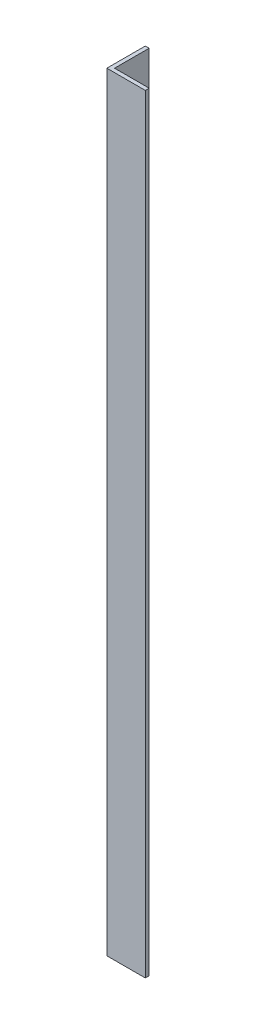
ISO-10303-21;
HEADER;
FILE_DESCRIPTION(('STEP AP214'),'2;1');
FILE_NAME('part.step','',(''),(''),'','','');
FILE_SCHEMA(('AUTOMOTIVE_DESIGN { 1 0 10303 214 1 1 1 1 }'));
ENDSEC;
DATA;
#1=APPLICATION_CONTEXT('core data for automotive mechanical design processes');
#2=APPLICATION_PROTOCOL_DEFINITION('international standard','automotive_design',2000,#1);
#3=PRODUCT_CONTEXT('',#1,'mechanical');
#4=PRODUCT('Part','Part','',(#3));
#5=PRODUCT_RELATED_PRODUCT_CATEGORY('part','',(#4));
#6=PRODUCT_DEFINITION_FORMATION('','',#4);
#7=PRODUCT_DEFINITION_CONTEXT('part definition',#1,'design');
#8=PRODUCT_DEFINITION('design','',#6,#7);
#9=PRODUCT_DEFINITION_SHAPE('','',#8);
#10=(LENGTH_UNIT() NAMED_UNIT(*) SI_UNIT(.MILLI.,.METRE.));
#11=(NAMED_UNIT(*) PLANE_ANGLE_UNIT() SI_UNIT($,.RADIAN.));
#12=(NAMED_UNIT(*) SI_UNIT($,.STERADIAN.) SOLID_ANGLE_UNIT());
#13=UNCERTAINTY_MEASURE_WITH_UNIT(LENGTH_MEASURE(1.E-05),#10,'distance_accuracy_value','');
#14=(GEOMETRIC_REPRESENTATION_CONTEXT(3) GLOBAL_UNCERTAINTY_ASSIGNED_CONTEXT((#13)) GLOBAL_UNIT_ASSIGNED_CONTEXT((#10,
#11,#12)) REPRESENTATION_CONTEXT('',''));
#15=CARTESIAN_POINT('',(0.,0.,0.));
#16=DIRECTION('',(0.,0.,1.));
#17=DIRECTION('',(1.,0.,0.));
#18=AXIS2_PLACEMENT_3D('',#15,#16,#17);
#19=CARTESIAN_POINT('',(2.,400.,0.));
#20=DIRECTION('',(0.,0.,1.));
#21=DIRECTION('',(1.,0.,0.));
#22=AXIS2_PLACEMENT_3D('',#19,#20,#21);
#23=PLANE('',#22);
#24=DIRECTION('',(-1.,0.,0.));
#25=VECTOR('',#24,1.);
#26=CARTESIAN_POINT('',(2.,0.,0.));
#27=LINE('',#26,#25);
#28=CARTESIAN_POINT('',(2.,0.,0.));
#29=VERTEX_POINT('',#28);
#30=CARTESIAN_POINT('',(0.,0.,0.));
#31=VERTEX_POINT('',#30);
#32=EDGE_CURVE('E119',#29,#31,#27,.T.);
#33=ORIENTED_EDGE('',*,*,#32,.T.);
#34=DIRECTION('',(0.,-1.,0.));
#35=VECTOR('',#34,1.);
#36=CARTESIAN_POINT('',(0.,400.,0.));
#37=LINE('',#36,#35);
#38=CARTESIAN_POINT('',(0.,400.,0.));
#39=VERTEX_POINT('',#38);
#40=EDGE_CURVE('E11',#39,#31,#37,.T.);
#41=ORIENTED_EDGE('',*,*,#40,.F.);
#42=DIRECTION('',(-1.,0.,0.));
#43=VECTOR('',#42,1.);
#44=CARTESIAN_POINT('',(2.,400.,0.));
#45=LINE('',#44,#43);
#46=CARTESIAN_POINT('',(2.,400.,0.));
#47=VERTEX_POINT('',#46);
#48=EDGE_CURVE('E129',#47,#39,#45,.T.);
#49=ORIENTED_EDGE('',*,*,#48,.F.);
#50=DIRECTION('',(0.,-1.,0.));
#51=VECTOR('',#50,1.);
#52=CARTESIAN_POINT('',(2.,400.,0.));
#53=LINE('',#52,#51);
#54=EDGE_CURVE('E115',#47,#29,#53,.T.);
#55=ORIENTED_EDGE('',*,*,#54,.T.);
#56=EDGE_LOOP('',(#33,#41,#49,#55));
#57=FACE_BOUND('',#56,.T.);
#58=ADVANCED_FACE('F35',(#57),#23,.F.);
#59=CARTESIAN_POINT('',(0.,400.,0.));
#60=DIRECTION('',(1.,0.,0.));
#61=DIRECTION('',(0.,0.,-1.));
#62=AXIS2_PLACEMENT_3D('',#59,#60,#61);
#63=PLANE('',#62);
#64=DIRECTION('',(0.,0.,1.));
#65=VECTOR('',#64,1.);
#66=CARTESIAN_POINT('',(0.,0.,0.));
#67=LINE('',#66,#65);
#68=CARTESIAN_POINT('',(0.,0.,20.));
#69=VERTEX_POINT('',#68);
#70=EDGE_CURVE('E122',#31,#69,#67,.T.);
#71=ORIENTED_EDGE('',*,*,#70,.T.);
#72=DIRECTION('',(0.,-1.,0.));
#73=VECTOR('',#72,1.);
#74=CARTESIAN_POINT('',(0.,400.,20.));
#75=LINE('',#74,#73);
#76=CARTESIAN_POINT('',(0.,400.,20.));
#77=VERTEX_POINT('',#76);
#78=EDGE_CURVE('E43',#77,#69,#75,.T.);
#79=ORIENTED_EDGE('',*,*,#78,.F.);
#80=DIRECTION('',(0.,0.,1.));
#81=VECTOR('',#80,1.);
#82=CARTESIAN_POINT('',(0.,400.,0.));
#83=LINE('',#82,#81);
#84=EDGE_CURVE('E88',#39,#77,#83,.T.);
#85=ORIENTED_EDGE('',*,*,#84,.F.);
#86=ORIENTED_EDGE('',*,*,#40,.T.);
#87=EDGE_LOOP('',(#71,#79,#85,#86));
#88=FACE_BOUND('',#87,.T.);
#89=ADVANCED_FACE('F153',(#88),#63,.F.);
#90=CARTESIAN_POINT('',(0.,400.,20.));
#91=DIRECTION('',(0.,0.,-1.));
#92=DIRECTION('',(-1.,0.,0.));
#93=AXIS2_PLACEMENT_3D('',#90,#91,#92);
#94=PLANE('',#93);
#95=DIRECTION('',(1.,0.,0.));
#96=VECTOR('',#95,1.);
#97=CARTESIAN_POINT('',(0.,0.,20.));
#98=LINE('',#97,#96);
#99=CARTESIAN_POINT('',(20.,0.,20.));
#100=VERTEX_POINT('',#99);
#101=EDGE_CURVE('E124',#69,#100,#98,.T.);
#102=ORIENTED_EDGE('',*,*,#101,.T.);
#103=DIRECTION('',(0.,-1.,0.));
#104=VECTOR('',#103,1.);
#105=CARTESIAN_POINT('',(20.,400.,20.));
#106=LINE('',#105,#104);
#107=CARTESIAN_POINT('',(20.,400.,20.));
#108=VERTEX_POINT('',#107);
#109=EDGE_CURVE('E110',#108,#100,#106,.T.);
#110=ORIENTED_EDGE('',*,*,#109,.F.);
#111=DIRECTION('',(1.,0.,0.));
#112=VECTOR('',#111,1.);
#113=CARTESIAN_POINT('',(0.,400.,20.));
#114=LINE('',#113,#112);
#115=EDGE_CURVE('E101',#77,#108,#114,.T.);
#116=ORIENTED_EDGE('',*,*,#115,.F.);
#117=ORIENTED_EDGE('',*,*,#78,.T.);
#118=EDGE_LOOP('',(#102,#110,#116,#117));
#119=FACE_BOUND('',#118,.T.);
#120=ADVANCED_FACE('F135',(#119),#94,.F.);
#121=CARTESIAN_POINT('',(20.,400.,20.));
#122=DIRECTION('',(-1.,0.,0.));
#123=DIRECTION('',(0.,0.,1.));
#124=AXIS2_PLACEMENT_3D('',#121,#122,#123);
#125=PLANE('',#124);
#126=DIRECTION('',(0.,0.,-1.));
#127=VECTOR('',#126,1.);
#128=CARTESIAN_POINT('',(20.,0.,20.));
#129=LINE('',#128,#127);
#130=CARTESIAN_POINT('',(20.,0.,18.));
#131=VERTEX_POINT('',#130);
#132=EDGE_CURVE('E109',#100,#131,#129,.T.);
#133=ORIENTED_EDGE('',*,*,#132,.T.);
#134=DIRECTION('',(0.,-1.,0.));
#135=VECTOR('',#134,1.);
#136=CARTESIAN_POINT('',(20.,400.,18.));
#137=LINE('',#136,#135);
#138=CARTESIAN_POINT('',(20.,400.,18.));
#139=VERTEX_POINT('',#138);
#140=EDGE_CURVE('E106',#139,#131,#137,.T.);
#141=ORIENTED_EDGE('',*,*,#140,.F.);
#142=DIRECTION('',(0.,0.,-1.));
#143=VECTOR('',#142,1.);
#144=CARTESIAN_POINT('',(20.,400.,20.));
#145=LINE('',#144,#143);
#146=EDGE_CURVE('E95',#108,#139,#145,.T.);
#147=ORIENTED_EDGE('',*,*,#146,.F.);
#148=ORIENTED_EDGE('',*,*,#109,.T.);
#149=EDGE_LOOP('',(#133,#141,#147,#148));
#150=FACE_BOUND('',#149,.T.);
#151=ADVANCED_FACE('F107',(#150),#125,.F.);
#152=CARTESIAN_POINT('',(20.,400.,18.));
#153=DIRECTION('',(0.,0.,1.));
#154=DIRECTION('',(1.,0.,0.));
#155=AXIS2_PLACEMENT_3D('',#152,#153,#154);
#156=PLANE('',#155);
#157=DIRECTION('',(-1.,0.,0.));
#158=VECTOR('',#157,1.);
#159=CARTESIAN_POINT('',(20.,0.,18.));
#160=LINE('',#159,#158);
#161=CARTESIAN_POINT('',(2.,0.,18.));
#162=VERTEX_POINT('',#161);
#163=EDGE_CURVE('E74',#131,#162,#160,.T.);
#164=ORIENTED_EDGE('',*,*,#163,.T.);
#165=DIRECTION('',(0.,-1.,0.));
#166=VECTOR('',#165,1.);
#167=CARTESIAN_POINT('',(2.,400.,18.));
#168=LINE('',#167,#166);
#169=CARTESIAN_POINT('',(2.,400.,18.));
#170=VERTEX_POINT('',#169);
#171=EDGE_CURVE('E111',#170,#162,#168,.T.);
#172=ORIENTED_EDGE('',*,*,#171,.F.);
#173=DIRECTION('',(-1.,0.,0.));
#174=VECTOR('',#173,1.);
#175=CARTESIAN_POINT('',(20.,400.,18.));
#176=LINE('',#175,#174);
#177=EDGE_CURVE('E99',#139,#170,#176,.T.);
#178=ORIENTED_EDGE('',*,*,#177,.F.);
#179=ORIENTED_EDGE('',*,*,#140,.T.);
#180=EDGE_LOOP('',(#164,#172,#178,#179));
#181=FACE_BOUND('',#180,.T.);
#182=ADVANCED_FACE('F113',(#181),#156,.F.);
#183=CARTESIAN_POINT('',(2.,400.,18.));
#184=DIRECTION('',(-1.,0.,0.));
#185=DIRECTION('',(0.,0.,1.));
#186=AXIS2_PLACEMENT_3D('',#183,#184,#185);
#187=PLANE('',#186);
#188=DIRECTION('',(0.,0.,-1.));
#189=VECTOR('',#188,1.);
#190=CARTESIAN_POINT('',(2.,0.,18.));
#191=LINE('',#190,#189);
#192=EDGE_CURVE('E80',#162,#29,#191,.T.);
#193=ORIENTED_EDGE('',*,*,#192,.T.);
#194=ORIENTED_EDGE('',*,*,#54,.F.);
#195=DIRECTION('',(0.,0.,-1.));
#196=VECTOR('',#195,1.);
#197=CARTESIAN_POINT('',(2.,400.,18.));
#198=LINE('',#197,#196);
#199=EDGE_CURVE('E51',#170,#47,#198,.T.);
#200=ORIENTED_EDGE('',*,*,#199,.F.);
#201=ORIENTED_EDGE('',*,*,#171,.T.);
#202=EDGE_LOOP('',(#193,#194,#200,#201));
#203=FACE_BOUND('',#202,.T.);
#204=ADVANCED_FACE('F142',(#203),#187,.F.);
#205=CARTESIAN_POINT('',(0.,400.,0.));
#206=DIRECTION('',(0.,1.,0.));
#207=DIRECTION('',(0.,0.,1.));
#208=AXIS2_PLACEMENT_3D('',#205,#206,#207);
#209=PLANE('',#208);
#210=ORIENTED_EDGE('',*,*,#48,.T.);
#211=ORIENTED_EDGE('',*,*,#84,.T.);
#212=ORIENTED_EDGE('',*,*,#115,.T.);
#213=ORIENTED_EDGE('',*,*,#146,.T.);
#214=ORIENTED_EDGE('',*,*,#177,.T.);
#215=ORIENTED_EDGE('',*,*,#199,.T.);
#216=EDGE_LOOP('',(#210,#211,#212,#213,#214,#215));
#217=FACE_BOUND('',#216,.T.);
#218=ADVANCED_FACE('F97',(#217),#209,.T.);
#219=CARTESIAN_POINT('',(0.,0.,0.));
#220=DIRECTION('',(0.,1.,0.));
#221=DIRECTION('',(0.,0.,1.));
#222=AXIS2_PLACEMENT_3D('',#219,#220,#221);
#223=PLANE('',#222);
#224=ORIENTED_EDGE('',*,*,#32,.F.);
#225=ORIENTED_EDGE('',*,*,#192,.F.);
#226=ORIENTED_EDGE('',*,*,#163,.F.);
#227=ORIENTED_EDGE('',*,*,#132,.F.);
#228=ORIENTED_EDGE('',*,*,#101,.F.);
#229=ORIENTED_EDGE('',*,*,#70,.F.);
#230=EDGE_LOOP('',(#224,#225,#226,#227,#228,#229));
#231=FACE_BOUND('',#230,.T.);
#232=ADVANCED_FACE('F138',(#231),#223,.F.);
#233=CLOSED_SHELL('',(#58,#89,#120,#151,#182,#204,#218,#232));
#234=MANIFOLD_SOLID_BREP('B2',#233);
#235=ADVANCED_BREP_SHAPE_REPRESENTATION('',(#18,#234),#14);
#236=SHAPE_DEFINITION_REPRESENTATION(#9,#235);
ENDSEC;
END-ISO-10303-21;
